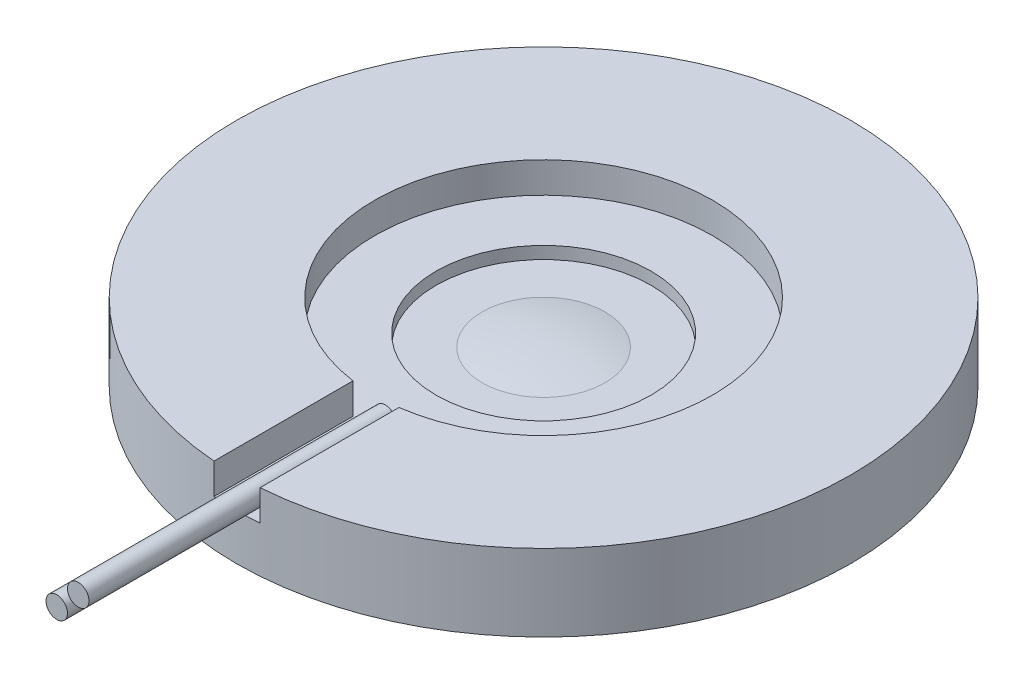
ISO-10303-21;
HEADER;
FILE_DESCRIPTION(('STEP AP214'),'2;1');
FILE_NAME('part.step','',(''),(''),'','','');
FILE_SCHEMA(('AUTOMOTIVE_DESIGN { 1 0 10303 214 1 1 1 1 }'));
ENDSEC;
DATA;
#1=APPLICATION_CONTEXT('core data for automotive mechanical design processes');
#2=APPLICATION_PROTOCOL_DEFINITION('international standard','automotive_design',2000,#1);
#3=PRODUCT_CONTEXT('',#1,'mechanical');
#4=PRODUCT('Part','Part','',(#3));
#5=PRODUCT_RELATED_PRODUCT_CATEGORY('part','',(#4));
#6=PRODUCT_DEFINITION_FORMATION('','',#4);
#7=PRODUCT_DEFINITION_CONTEXT('part definition',#1,'design');
#8=PRODUCT_DEFINITION('design','',#6,#7);
#9=PRODUCT_DEFINITION_SHAPE('','',#8);
#10=(LENGTH_UNIT() NAMED_UNIT(*) SI_UNIT(.MILLI.,.METRE.));
#11=(NAMED_UNIT(*) PLANE_ANGLE_UNIT() SI_UNIT($,.RADIAN.));
#12=(NAMED_UNIT(*) SI_UNIT($,.STERADIAN.) SOLID_ANGLE_UNIT());
#13=UNCERTAINTY_MEASURE_WITH_UNIT(LENGTH_MEASURE(1.E-05),#10,'distance_accuracy_value','');
#14=(GEOMETRIC_REPRESENTATION_CONTEXT(3) GLOBAL_UNCERTAINTY_ASSIGNED_CONTEXT((#13)) GLOBAL_UNIT_ASSIGNED_CONTEXT((#10,
#11,#12)) REPRESENTATION_CONTEXT('',''));
#15=CARTESIAN_POINT('',(0.,0.,0.));
#16=DIRECTION('',(0.,0.,1.));
#17=DIRECTION('',(1.,0.,0.));
#18=AXIS2_PLACEMENT_3D('',#15,#16,#17);
#19=CARTESIAN_POINT('',(0.35,1.05,15.5));
#20=DIRECTION('',(0.,0.,-1.));
#21=DIRECTION('',(-1.,0.,0.));
#22=AXIS2_PLACEMENT_3D('',#19,#20,#21);
#23=CYLINDRICAL_SURFACE('',#22,0.35);
#24=CARTESIAN_POINT('',(0.35,1.05,15.5));
#25=DIRECTION('',(0.,0.,1.));
#26=DIRECTION('',(1.,0.,0.));
#27=AXIS2_PLACEMENT_3D('',#24,#25,#26);
#28=CIRCLE('',#27,0.35);
#29=CARTESIAN_POINT('',(0.7,1.05,15.5));
#30=VERTEX_POINT('',#29);
#31=EDGE_CURVE('E11',#30,#30,#28,.T.);
#32=ORIENTED_EDGE('',*,*,#31,.F.);
#33=EDGE_LOOP('',(#32));
#34=FACE_BOUND('',#33,.T.);
#35=CARTESIAN_POINT('',(0.35,1.05,5.5));
#36=DIRECTION('',(0.,0.,1.));
#37=DIRECTION('',(1.,0.,0.));
#38=AXIS2_PLACEMENT_3D('',#35,#36,#37);
#39=CIRCLE('',#38,0.35);
#40=CARTESIAN_POINT('',(0.7,1.05,5.5));
#41=VERTEX_POINT('',#40);
#42=EDGE_CURVE('E45',#41,#41,#39,.T.);
#43=ORIENTED_EDGE('',*,*,#42,.T.);
#44=EDGE_LOOP('',(#43));
#45=FACE_BOUND('',#44,.T.);
#46=ADVANCED_FACE('F42',(#34,#45),#23,.T.);
#47=CARTESIAN_POINT('',(0.35,1.05,15.5));
#48=DIRECTION('',(0.,0.,1.));
#49=DIRECTION('',(1.,0.,0.));
#50=AXIS2_PLACEMENT_3D('',#47,#48,#49);
#51=PLANE('',#50);
#52=ORIENTED_EDGE('',*,*,#31,.T.);
#53=EDGE_LOOP('',(#52));
#54=FACE_BOUND('',#53,.T.);
#55=ADVANCED_FACE('F57',(#54),#51,.T.);
#56=CARTESIAN_POINT('',(0.35,1.05,5.5));
#57=DIRECTION('',(0.,0.,1.));
#58=DIRECTION('',(1.,0.,0.));
#59=AXIS2_PLACEMENT_3D('',#56,#57,#58);
#60=PLANE('',#59);
#61=ORIENTED_EDGE('',*,*,#42,.F.);
#62=EDGE_LOOP('',(#61));
#63=FACE_BOUND('',#62,.T.);
#64=ADVANCED_FACE('F55',(#63),#60,.F.);
#65=CLOSED_SHELL('',(#46,#55,#64));
#66=MANIFOLD_SOLID_BREP('B2',#65);
#67=CARTESIAN_POINT('',(0.,-1.21621002522873,0.));
#68=DIRECTION('',(0.,-1.,0.));
#69=DIRECTION('',(0.,0.,-1.));
#70=AXIS2_PLACEMENT_3D('',#67,#68,#69);
#71=CYLINDRICAL_SURFACE('',#70,10.);
#72=CARTESIAN_POINT('',(0.,-1.,0.));
#73=DIRECTION('',(0.,-1.,0.));
#74=DIRECTION('',(0.,0.,-1.));
#75=AXIS2_PLACEMENT_3D('',#72,#73,#74);
#76=CIRCLE('',#75,10.);
#77=CARTESIAN_POINT('',(0.,-1.,-10.));
#78=VERTEX_POINT('',#77);
#79=EDGE_CURVE('E210',#78,#78,#76,.T.);
#80=ORIENTED_EDGE('',*,*,#79,.F.);
#81=EDGE_LOOP('',(#80));
#82=FACE_BOUND('',#81,.T.);
#83=CARTESIAN_POINT('',(-0.7,0.35,9.97546991374341));
#84=CARTESIAN_POINT('',(-0.699999126577995,0.330371185065,9.97547002720199));
#85=CARTESIAN_POINT('',(-0.698343158393343,0.310728273173269,9.97558660631598));
#86=CARTESIAN_POINT('',(-0.691760965476584,0.271984473634161,9.97604516974576));
#87=CARTESIAN_POINT('',(-0.68683084283142,0.252884260371821,9.97638742272504));
#88=CARTESIAN_POINT('',(-0.673843019205228,0.215793349188861,9.97727305953802));
#89=CARTESIAN_POINT('',(-0.665787013587679,0.197802055950145,9.97781633433751));
#90=CARTESIAN_POINT('',(-0.646779797303418,0.163432682869438,9.97906639737199));
#91=CARTESIAN_POINT('',(-0.635829272108382,0.147054222339894,9.97977314688842));
#92=CARTESIAN_POINT('',(-0.611325230030255,0.116343038825657,9.98130411980233));
#93=CARTESIAN_POINT('',(-0.597767912589196,0.102013356694386,9.98212851426149));
#94=CARTESIAN_POINT('',(-0.568444171118474,0.0758312133738326,9.98384126875019));
#95=CARTESIAN_POINT('',(-0.552677638996305,0.0639788734667529,9.98472963190856));
#96=CARTESIAN_POINT('',(-0.519349671279672,0.0430660846216249,9.98651863767634));
#97=CARTESIAN_POINT('',(-0.50178493127607,0.0340109029880342,9.98741930015766));
#98=CARTESIAN_POINT('',(-0.465382238795801,0.0189792800572292,9.98918170364694));
#99=CARTESIAN_POINT('',(-0.44654428539803,0.0130028409873526,9.99004344462675));
#100=CARTESIAN_POINT('',(-0.408122933895856,0.00429806621516208,9.99168680938713));
#101=CARTESIAN_POINT('',(-0.388539317194798,0.00157069068400113,9.99246840942194));
#102=CARTESIAN_POINT('',(-0.349188231312043,-0.00055325991143094,9.99392091091746));
#103=CARTESIAN_POINT('',(-0.32942076353444,5.01396075724951E-05,9.99459181322286));
#104=CARTESIAN_POINT('',(-0.290285281214526,0.00457019346665059,9.99580499170035));
#105=CARTESIAN_POINT('',(-0.270916870339192,0.00848338025240826,9.99634740172852));
#106=CARTESIAN_POINT('',(-0.233109662441507,0.0195088815881999,9.99730052090676));
#107=CARTESIAN_POINT('',(-0.214670861227781,0.0266211817128034,9.99771123065068));
#108=CARTESIAN_POINT('',(-0.179266057630678,0.0438350225603465,9.99840873557071));
#109=CARTESIAN_POINT('',(-0.162298608645276,0.0539335831561949,9.99869565358566));
#110=CARTESIAN_POINT('',(-0.130298589102108,0.0768362729505625,9.99916390387877));
#111=CARTESIAN_POINT('',(-0.115266015535367,0.0896403979415073,9.99934523632112));
#112=CARTESIAN_POINT('',(-0.0875659908009353,0.117587863733298,9.99962621665661));
#113=CARTESIAN_POINT('',(-0.074898051804421,0.132730720868452,9.99972588141237));
#114=CARTESIAN_POINT('',(-0.0522831418271938,0.164927863079583,9.99986973810907));
#115=CARTESIAN_POINT('',(-0.0423361739133705,0.181982150309962,9.99991392998749));
#116=CARTESIAN_POINT('',(-0.0254437349668777,0.217521998800979,9.99997121678546));
#117=CARTESIAN_POINT('',(-0.0184988950833139,0.236007860064744,9.99998430516859));
#118=CARTESIAN_POINT('',(-0.00781086524070632,0.273883063441466,9.99999838975036));
#119=CARTESIAN_POINT('',(-0.00406767692141496,0.293272406017143,9.9999993859428));
#120=CARTESIAN_POINT('',(0.000111067984359034,0.332406683310703,10.0000002226889));
#121=CARTESIAN_POINT('',(0.000546224465177146,0.352151660753053,10.0000000631029));
#122=CARTESIAN_POINT('',(-0.00190450471823933,0.391434431398475,9.99999989078871));
#123=CARTESIAN_POINT('',(-0.0047903917578348,0.410972224515741,9.9999998780607));
#124=CARTESIAN_POINT('',(-0.0138013360636407,0.449286212412607,9.99999148062873));
#125=CARTESIAN_POINT('',(-0.0199264270451348,0.46806239926283,9.99998309583763));
#126=CARTESIAN_POINT('',(-0.0352419197869961,0.504319940606687,9.99994081536782));
#127=CARTESIAN_POINT('',(-0.0444323216859587,0.521801295041777,9.99990691968796));
#128=CARTESIAN_POINT('',(-0.0656171864656242,0.55497239985758,9.99979030566469));
#129=CARTESIAN_POINT('',(-0.0776115742031563,0.570662198232895,9.99970758862953));
#130=CARTESIAN_POINT('',(-0.10406378839302,0.599805197300735,9.99946724592183));
#131=CARTESIAN_POINT('',(-0.11852161193156,0.613258400638702,9.99930962033789));
#132=CARTESIAN_POINT('',(-0.149486970050226,0.637544118210207,9.99889458404381));
#133=CARTESIAN_POINT('',(-0.165994149392374,0.648377085681652,9.99863719061119));
#134=CARTESIAN_POINT('',(-0.200590679551237,0.667118100091112,9.99800291624993));
#135=CARTESIAN_POINT('',(-0.218680024985086,0.675026156979818,9.99762603572781));
#136=CARTESIAN_POINT('',(-0.255923438691734,0.687692789046867,9.99674196009453));
#137=CARTESIAN_POINT('',(-0.275077338663992,0.692451860536824,9.99623478553651));
#138=CARTESIAN_POINT('',(-0.313908289945575,0.698689086987504,9.99509073152979));
#139=CARTESIAN_POINT('',(-0.333585343130569,0.700167230183454,9.99445385161599));
#140=CARTESIAN_POINT('',(-0.372913139408768,0.699802604738925,9.99306375048387));
#141=CARTESIAN_POINT('',(-0.39256386709513,0.697958373018055,9.99231047814316));
#142=CARTESIAN_POINT('',(-0.431273993270205,0.691000395225955,9.99071459765174));
#143=CARTESIAN_POINT('',(-0.450333386104116,0.685886617898899,9.98987198864709));
#144=CARTESIAN_POINT('',(-0.487343930658975,0.672527760454949,9.98813495025384));
#145=CARTESIAN_POINT('',(-0.505293764751221,0.664279037524943,9.98724046160957));
#146=CARTESIAN_POINT('',(-0.539552778667938,0.644885030269947,9.98544828329611));
#147=CARTESIAN_POINT('',(-0.555862010591896,0.633739837966468,9.98455059372951));
#148=CARTESIAN_POINT('',(-0.586389423347292,0.60885915703804,9.98280430526458));
#149=CARTESIAN_POINT('',(-0.60060617836213,0.595121916600275,9.98195574007634));
#150=CARTESIAN_POINT('',(-0.626534518415717,0.565445869713904,9.98036190368925));
#151=CARTESIAN_POINT('',(-0.638245494899742,0.549506530005546,9.97961665759795));
#152=CARTESIAN_POINT('',(-0.658819113535951,0.515888945170164,9.97827960932602));
#153=CARTESIAN_POINT('',(-0.667682783466783,0.498211330516201,9.97768775179238));
#154=CARTESIAN_POINT('',(-0.682304879582627,0.461627156791338,9.97669856579779));
#155=CARTESIAN_POINT('',(-0.688067046955156,0.442722109313555,9.97630100302232));
#156=CARTESIAN_POINT('',(-0.694791276832854,0.411413927255972,9.97583436744768));
#157=CARTESIAN_POINT('',(-0.696742057570016,0.399215269914491,9.97569808270832));
#158=CARTESIAN_POINT('',(-0.699346692716377,0.374679599492876,9.97551582025732));
#159=CARTESIAN_POINT('',(-0.700000549207215,0.362342586634844,9.97546984240073));
#160=CARTESIAN_POINT('',(-0.7,0.35,9.97546991374341));
#161=B_SPLINE_CURVE_WITH_KNOTS('',3,(#83,#84,#85,#86,#87,#88,#89,#90,#91,#92,#93,#94,#95,#96,
#97,#98,#99,#100,#101,#102,#103,#104,#105,#106,#107,#108,#109,#110,#111,#112,#113,#114,#115,
#116,#117,#118,#119,#120,#121,#122,#123,#124,#125,#126,#127,#128,#129,#130,#131,#132,#133,#134,
#135,#136,#137,#138,#139,#140,#141,#142,#143,#144,#145,#146,#147,#148,#149,#150,#151,#152,#153,
#154,#155,#156,#157,#158,#159,#160),.UNSPECIFIED.,.T.,.F.,(4,2,2,2,2,2,2,2,2,2,2,2,2,2,2,2,2,2,
2,2,2,2,2,2,2,2,2,2,2,2,2,2,2,2,2,2,2,2,4),(0.,0.05884133984549,0.117752856761926,
0.176632466807841,0.235498145629502,0.294450307154655,0.353405354100388,0.412470751370796,
0.471536191372415,0.5306190822097,0.589701522193501,0.648722140027291,0.707742491728189,
0.766704141930791,0.825665700439513,0.884615081584976,0.943564529173814,1.00252636391523,
1.06148822885442,1.12045722510371,1.17942624577415,1.23839588023626,1.29736551736462,
1.35633357436459,1.41530156161667,1.47425934151622,1.5332169208366,1.59216520563767,
1.65111370181553,1.71008816359775,1.76906318916571,1.8281069544028,1.88714884403487,
1.94623078046516,2.00532704932102,2.06440196244612,2.12340545584628,2.16040491316662,
2.19740431110064),.UNSPECIFIED.);
#162=CARTESIAN_POINT('',(-0.666227766016838,0.499999999999999,9.97778234698414));
#163=VERTEX_POINT('',#162);
#164=CARTESIAN_POINT('',(-0.0337722339831618,0.499999999999999,9.99994297164798));
#165=VERTEX_POINT('',#164);
#166=EDGE_CURVE('E105',#163,#165,#161,.T.);
#167=ORIENTED_EDGE('',*,*,#166,.F.);
#168=CARTESIAN_POINT('',(0.,0.499999999999999,0.));
#169=DIRECTION('',(0.,-1.,0.));
#170=DIRECTION('',(0.,0.,-1.));
#171=AXIS2_PLACEMENT_3D('',#168,#169,#170);
#172=CIRCLE('',#171,10.);
#173=CARTESIAN_POINT('',(-0.75794299769201,0.5,9.97123474862816));
#174=VERTEX_POINT('',#173);
#175=EDGE_CURVE('E135',#163,#174,#172,.T.);
#176=ORIENTED_EDGE('',*,*,#175,.T.);
#177=DIRECTION('',(0.,-1.,0.));
#178=VECTOR('',#177,1.);
#179=CARTESIAN_POINT('',(-0.75794299769201,-1.21621002522873,9.97123474862816));
#180=LINE('',#179,#178);
#181=CARTESIAN_POINT('',(-0.75794299769201,1.5,9.97123474862816));
#182=VERTEX_POINT('',#181);
#183=EDGE_CURVE('E355',#174,#182,#180,.F.);
#184=ORIENTED_EDGE('',*,*,#183,.T.);
#185=CARTESIAN_POINT('',(0.,1.5,0.));
#186=DIRECTION('',(0.,-1.,0.));
#187=DIRECTION('',(0.,0.,-1.));
#188=AXIS2_PLACEMENT_3D('',#185,#186,#187);
#189=CIRCLE('',#188,10.);
#190=CARTESIAN_POINT('',(0.74205700230799,1.5,9.97242956381872));
#191=VERTEX_POINT('',#190);
#192=EDGE_CURVE('E213',#182,#191,#189,.T.);
#193=ORIENTED_EDGE('',*,*,#192,.T.);
#194=DIRECTION('',(0.,-1.,0.));
#195=VECTOR('',#194,1.);
#196=CARTESIAN_POINT('',(0.74205700230799,-1.21621002522873,9.97242956381872));
#197=LINE('',#196,#195);
#198=CARTESIAN_POINT('',(0.74205700230799,0.5,9.97242956381872));
#199=VERTEX_POINT('',#198);
#200=EDGE_CURVE('E361',#191,#199,#197,.T.);
#201=ORIENTED_EDGE('',*,*,#200,.T.);
#202=EDGE_CURVE('E353',#199,#165,#172,.T.);
#203=ORIENTED_EDGE('',*,*,#202,.T.);
#204=EDGE_LOOP('',(#167,#176,#184,#193,#201,#203));
#205=FACE_BOUND('',#204,.T.);
#206=ADVANCED_FACE('F82',(#82,#205),#71,.T.);
#207=CARTESIAN_POINT('',(-5.5,0.499999999999999,0.));
#208=DIRECTION('',(0.,-1.,0.));
#209=DIRECTION('',(0.,0.,-1.));
#210=AXIS2_PLACEMENT_3D('',#207,#208,#209);
#211=PLANE('',#210);
#212=CARTESIAN_POINT('',(0.,0.499999999999999,0.));
#213=DIRECTION('',(0.,-1.,0.));
#214=DIRECTION('',(0.,0.,-1.));
#215=AXIS2_PLACEMENT_3D('',#212,#213,#214);
#216=CIRCLE('',#215,3.5);
#217=CARTESIAN_POINT('',(0.,0.499999999999999,-3.5));
#218=VERTEX_POINT('',#217);
#219=EDGE_CURVE('E344',#218,#218,#216,.T.);
#220=ORIENTED_EDGE('',*,*,#219,.T.);
#221=EDGE_LOOP('',(#220));
#222=FACE_BOUND('',#221,.T.);
#223=DIRECTION('',(0.,0.,-1.));
#224=VECTOR('',#223,1.);
#225=CARTESIAN_POINT('',(-0.666227766016838,0.499999999999999,15.5));
#226=LINE('',#225,#224);
#227=CARTESIAN_POINT('',(-0.666227766016838,0.499999999999999,5.5));
#228=VERTEX_POINT('',#227);
#229=EDGE_CURVE('E40',#228,#163,#226,.F.);
#230=ORIENTED_EDGE('',*,*,#229,.F.);
#231=DIRECTION('',(-1.,0.,0.));
#232=VECTOR('',#231,1.);
#233=CARTESIAN_POINT('',(-5.5,0.499999999999999,5.5));
#234=LINE('',#233,#232);
#235=CARTESIAN_POINT('',(-0.0337722339831618,0.499999999999999,5.5));
#236=VERTEX_POINT('',#235);
#237=EDGE_CURVE('E97',#236,#228,#234,.T.);
#238=ORIENTED_EDGE('',*,*,#237,.F.);
#239=DIRECTION('',(0.,0.,-1.));
#240=VECTOR('',#239,1.);
#241=CARTESIAN_POINT('',(-0.0337722339831618,0.499999999999999,15.5));
#242=LINE('',#241,#240);
#243=EDGE_CURVE('E90',#165,#236,#242,.T.);
#244=ORIENTED_EDGE('',*,*,#243,.F.);
#245=ORIENTED_EDGE('',*,*,#202,.F.);
#246=DIRECTION('',(0.,0.,-1.));
#247=VECTOR('',#246,1.);
#248=CARTESIAN_POINT('',(0.74205700230799,0.5,10.5892241721086));
#249=LINE('',#248,#247);
#250=CARTESIAN_POINT('',(0.74205700230799,0.5,5.44971113044771));
#251=VERTEX_POINT('',#250);
#252=EDGE_CURVE('E367',#199,#251,#249,.T.);
#253=ORIENTED_EDGE('',*,*,#252,.T.);
#254=CARTESIAN_POINT('',(0.,0.499999999999999,0.));
#255=DIRECTION('',(0.,-1.,0.));
#256=DIRECTION('',(0.,0.,-1.));
#257=AXIS2_PLACEMENT_3D('',#254,#255,#256);
#258=CIRCLE('',#257,5.5);
#259=CARTESIAN_POINT('',(-0.75794299769201,0.5,5.44752442970655));
#260=VERTEX_POINT('',#259);
#261=EDGE_CURVE('E341',#260,#251,#258,.T.);
#262=ORIENTED_EDGE('',*,*,#261,.F.);
#263=DIRECTION('',(0.,0.,1.));
#264=VECTOR('',#263,1.);
#265=CARTESIAN_POINT('',(-0.75794299769201,0.5,10.5892241721086));
#266=LINE('',#265,#264);
#267=EDGE_CURVE('E368',#260,#174,#266,.T.);
#268=ORIENTED_EDGE('',*,*,#267,.T.);
#269=ORIENTED_EDGE('',*,*,#175,.F.);
#270=EDGE_LOOP('',(#230,#238,#244,#245,#253,#262,#268,#269));
#271=FACE_BOUND('',#270,.T.);
#272=ADVANCED_FACE('F133',(#222,#271),#211,.F.);
#273=CARTESIAN_POINT('',(0.,-9.8,0.));
#274=DIRECTION('',(0.,-1.,0.));
#275=DIRECTION('',(-1.,0.,0.));
#276=AXIS2_PLACEMENT_3D('',#273,#274,#275);
#277=SPHERICAL_SURFACE('',#276,10.);
#278=CARTESIAN_POINT('',(0.,0.,0.));
#279=DIRECTION('',(0.,-1.,0.));
#280=DIRECTION('',(0.,0.,-1.));
#281=AXIS2_PLACEMENT_3D('',#278,#279,#280);
#282=CIRCLE('',#281,1.98997487421324);
#283=CARTESIAN_POINT('',(0.,0.,-1.98997487421324));
#284=VERTEX_POINT('',#283);
#285=EDGE_CURVE('E142',#284,#284,#282,.T.);
#286=ORIENTED_EDGE('',*,*,#285,.T.);
#287=EDGE_LOOP('',(#286));
#288=FACE_BOUND('',#287,.T.);
#289=ADVANCED_FACE('F84',(#288),#277,.F.);
#290=CARTESIAN_POINT('',(-1.98997487421324,0.,0.));
#291=DIRECTION('',(0.,1.,0.));
#292=DIRECTION('',(0.,0.,1.));
#293=AXIS2_PLACEMENT_3D('',#290,#291,#292);
#294=PLANE('',#293);
#295=CARTESIAN_POINT('',(0.,0.,0.));
#296=DIRECTION('',(0.,-1.,0.));
#297=DIRECTION('',(0.,0.,-1.));
#298=AXIS2_PLACEMENT_3D('',#295,#296,#297);
#299=CIRCLE('',#298,6.);
#300=CARTESIAN_POINT('',(0.,0.,-6.));
#301=VERTEX_POINT('',#300);
#302=EDGE_CURVE('E216',#301,#301,#299,.T.);
#303=ORIENTED_EDGE('',*,*,#302,.T.);
#304=EDGE_LOOP('',(#303));
#305=FACE_BOUND('',#304,.T.);
#306=ORIENTED_EDGE('',*,*,#285,.F.);
#307=EDGE_LOOP('',(#306));
#308=FACE_BOUND('',#307,.T.);
#309=ADVANCED_FACE('F229',(#305,#308),#294,.F.);
#310=CARTESIAN_POINT('',(0.,-1.21621002522873,0.));
#311=DIRECTION('',(0.,-1.,0.));
#312=DIRECTION('',(0.,0.,-1.));
#313=AXIS2_PLACEMENT_3D('',#310,#311,#312);
#314=CYLINDRICAL_SURFACE('',#313,6.);
#315=ORIENTED_EDGE('',*,*,#302,.F.);
#316=EDGE_LOOP('',(#315));
#317=FACE_BOUND('',#316,.T.);
#318=CARTESIAN_POINT('',(0.,-1.,0.));
#319=DIRECTION('',(0.,-1.,0.));
#320=DIRECTION('',(0.,0.,-1.));
#321=AXIS2_PLACEMENT_3D('',#318,#319,#320);
#322=CIRCLE('',#321,6.);
#323=CARTESIAN_POINT('',(0.,-1.,-6.));
#324=VERTEX_POINT('',#323);
#325=EDGE_CURVE('E212',#324,#324,#322,.T.);
#326=ORIENTED_EDGE('',*,*,#325,.T.);
#327=EDGE_LOOP('',(#326));
#328=FACE_BOUND('',#327,.T.);
#329=ADVANCED_FACE('F201',(#317,#328),#314,.F.);
#330=CARTESIAN_POINT('',(-6.,-1.,0.));
#331=DIRECTION('',(0.,1.,0.));
#332=DIRECTION('',(0.,0.,1.));
#333=AXIS2_PLACEMENT_3D('',#330,#331,#332);
#334=PLANE('',#333);
#335=ORIENTED_EDGE('',*,*,#325,.F.);
#336=EDGE_LOOP('',(#335));
#337=FACE_BOUND('',#336,.T.);
#338=ORIENTED_EDGE('',*,*,#79,.T.);
#339=EDGE_LOOP('',(#338));
#340=FACE_BOUND('',#339,.T.);
#341=ADVANCED_FACE('F196',(#337,#340),#334,.F.);
#342=CARTESIAN_POINT('',(-10.,1.5,0.));
#343=DIRECTION('',(0.,-1.,0.));
#344=DIRECTION('',(0.,0.,-1.));
#345=AXIS2_PLACEMENT_3D('',#342,#343,#344);
#346=PLANE('',#345);
#347=ORIENTED_EDGE('',*,*,#192,.F.);
#348=DIRECTION('',(0.,0.,1.));
#349=VECTOR('',#348,1.);
#350=CARTESIAN_POINT('',(-0.75794299769201,1.5,10.5892241721086));
#351=LINE('',#350,#349);
#352=CARTESIAN_POINT('',(-0.75794299769201,1.5,5.44752442970655));
#353=VERTEX_POINT('',#352);
#354=EDGE_CURVE('E157',#353,#182,#351,.T.);
#355=ORIENTED_EDGE('',*,*,#354,.F.);
#356=CARTESIAN_POINT('',(0.,1.5,0.));
#357=DIRECTION('',(0.,-1.,0.));
#358=DIRECTION('',(0.,0.,-1.));
#359=AXIS2_PLACEMENT_3D('',#356,#357,#358);
#360=CIRCLE('',#359,5.5);
#361=CARTESIAN_POINT('',(0.74205700230799,1.5,5.44971113044771));
#362=VERTEX_POINT('',#361);
#363=EDGE_CURVE('E219',#353,#362,#360,.T.);
#364=ORIENTED_EDGE('',*,*,#363,.T.);
#365=DIRECTION('',(0.,0.,-1.));
#366=VECTOR('',#365,1.);
#367=CARTESIAN_POINT('',(0.74205700230799,1.5,10.5892241721086));
#368=LINE('',#367,#366);
#369=EDGE_CURVE('E156',#191,#362,#368,.T.);
#370=ORIENTED_EDGE('',*,*,#369,.F.);
#371=EDGE_LOOP('',(#347,#355,#364,#370));
#372=FACE_BOUND('',#371,.T.);
#373=ADVANCED_FACE('F193',(#372),#346,.F.);
#374=CARTESIAN_POINT('',(0.,-1.21621002522873,0.));
#375=DIRECTION('',(0.,-1.,0.));
#376=DIRECTION('',(0.,0.,-1.));
#377=AXIS2_PLACEMENT_3D('',#374,#375,#376);
#378=CYLINDRICAL_SURFACE('',#377,5.5);
#379=ORIENTED_EDGE('',*,*,#363,.F.);
#380=DIRECTION('',(0.,-1.,0.));
#381=VECTOR('',#380,1.);
#382=CARTESIAN_POINT('',(-0.75794299769201,-1.21621002522873,5.44752442970655));
#383=LINE('',#382,#381);
#384=EDGE_CURVE('E358',#353,#260,#383,.T.);
#385=ORIENTED_EDGE('',*,*,#384,.T.);
#386=ORIENTED_EDGE('',*,*,#261,.T.);
#387=DIRECTION('',(0.,-1.,0.));
#388=VECTOR('',#387,1.);
#389=CARTESIAN_POINT('',(0.74205700230799,-1.21621002522873,5.44971113044771));
#390=LINE('',#389,#388);
#391=EDGE_CURVE('E364',#251,#362,#390,.F.);
#392=ORIENTED_EDGE('',*,*,#391,.T.);
#393=EDGE_LOOP('',(#379,#385,#386,#392));
#394=FACE_BOUND('',#393,.T.);
#395=ADVANCED_FACE('F187',(#394),#378,.F.);
#396=CARTESIAN_POINT('',(0.,-1.21621002522873,0.));
#397=DIRECTION('',(0.,-1.,0.));
#398=DIRECTION('',(0.,0.,-1.));
#399=AXIS2_PLACEMENT_3D('',#396,#397,#398);
#400=CYLINDRICAL_SURFACE('',#399,3.5);
#401=ORIENTED_EDGE('',*,*,#219,.F.);
#402=EDGE_LOOP('',(#401));
#403=FACE_BOUND('',#402,.T.);
#404=CARTESIAN_POINT('',(0.,0.0999999999999998,0.));
#405=DIRECTION('',(0.,-1.,0.));
#406=DIRECTION('',(0.,0.,-1.));
#407=AXIS2_PLACEMENT_3D('',#404,#405,#406);
#408=CIRCLE('',#407,3.5);
#409=CARTESIAN_POINT('',(0.,0.0999999999999998,-3.5));
#410=VERTEX_POINT('',#409);
#411=EDGE_CURVE('E347',#410,#410,#408,.T.);
#412=ORIENTED_EDGE('',*,*,#411,.T.);
#413=EDGE_LOOP('',(#412));
#414=FACE_BOUND('',#413,.T.);
#415=ADVANCED_FACE('F183',(#403,#414),#400,.F.);
#416=CARTESIAN_POINT('',(-3.5,0.0999999999999997,0.));
#417=DIRECTION('',(0.,-1.,0.));
#418=DIRECTION('',(0.,0.,-1.));
#419=AXIS2_PLACEMENT_3D('',#416,#417,#418);
#420=PLANE('',#419);
#421=ORIENTED_EDGE('',*,*,#411,.F.);
#422=EDGE_LOOP('',(#421));
#423=FACE_BOUND('',#422,.T.);
#424=CARTESIAN_POINT('',(0.,0.0999999999999996,0.));
#425=DIRECTION('',(0.,-1.,0.));
#426=DIRECTION('',(0.,0.,-1.));
#427=AXIS2_PLACEMENT_3D('',#424,#425,#426);
#428=CIRCLE('',#427,2.);
#429=CARTESIAN_POINT('',(0.,0.0999999999999996,-2.));
#430=VERTEX_POINT('',#429);
#431=EDGE_CURVE('E350',#430,#430,#428,.T.);
#432=ORIENTED_EDGE('',*,*,#431,.T.);
#433=EDGE_LOOP('',(#432));
#434=FACE_BOUND('',#433,.T.);
#435=ADVANCED_FACE('F179',(#423,#434),#420,.F.);
#436=CARTESIAN_POINT('',(0.,-9.8,0.));
#437=DIRECTION('',(0.,-1.,0.));
#438=DIRECTION('',(-1.,0.,0.));
#439=AXIS2_PLACEMENT_3D('',#436,#437,#438);
#440=SPHERICAL_SURFACE('',#439,10.1);
#441=ORIENTED_EDGE('',*,*,#431,.F.);
#442=EDGE_LOOP('',(#441));
#443=FACE_BOUND('',#442,.T.);
#444=ADVANCED_FACE('F175',(#443),#440,.T.);
#445=CARTESIAN_POINT('',(-0.75794299769201,-6.03634580075554,10.5892241721086));
#446=DIRECTION('',(-1.,0.,0.));
#447=DIRECTION('',(0.,0.,1.));
#448=AXIS2_PLACEMENT_3D('',#445,#446,#447);
#449=PLANE('',#448);
#450=ORIENTED_EDGE('',*,*,#267,.F.);
#451=ORIENTED_EDGE('',*,*,#384,.F.);
#452=ORIENTED_EDGE('',*,*,#354,.T.);
#453=ORIENTED_EDGE('',*,*,#183,.F.);
#454=EDGE_LOOP('',(#450,#451,#452,#453));
#455=FACE_BOUND('',#454,.T.);
#456=ADVANCED_FACE('F171',(#455),#449,.F.);
#457=CARTESIAN_POINT('',(0.74205700230799,-6.03634580075554,10.5892241721086));
#458=DIRECTION('',(1.,0.,0.));
#459=DIRECTION('',(0.,0.,-1.));
#460=AXIS2_PLACEMENT_3D('',#457,#458,#459);
#461=PLANE('',#460);
#462=ORIENTED_EDGE('',*,*,#369,.T.);
#463=ORIENTED_EDGE('',*,*,#391,.F.);
#464=ORIENTED_EDGE('',*,*,#252,.F.);
#465=ORIENTED_EDGE('',*,*,#200,.F.);
#466=EDGE_LOOP('',(#462,#463,#464,#465));
#467=FACE_BOUND('',#466,.T.);
#468=ADVANCED_FACE('F166',(#467),#461,.F.);
#469=CARTESIAN_POINT('',(-0.35,0.35,15.5));
#470=DIRECTION('',(0.,0.,-1.));
#471=DIRECTION('',(-1.,0.,0.));
#472=AXIS2_PLACEMENT_3D('',#469,#470,#471);
#473=CYLINDRICAL_SURFACE('',#472,0.35);
#474=CARTESIAN_POINT('',(-0.35,0.35,15.5));
#475=DIRECTION('',(0.,0.,1.));
#476=DIRECTION('',(1.,0.,0.));
#477=AXIS2_PLACEMENT_3D('',#474,#475,#476);
#478=CIRCLE('',#477,0.35);
#479=CARTESIAN_POINT('',(0.,0.35,15.5));
#480=VERTEX_POINT('',#479);
#481=EDGE_CURVE('E145',#480,#480,#478,.T.);
#482=ORIENTED_EDGE('',*,*,#481,.F.);
#483=EDGE_LOOP('',(#482));
#484=FACE_BOUND('',#483,.T.);
#485=CARTESIAN_POINT('',(-0.35,0.35,5.5));
#486=DIRECTION('',(0.,0.,1.));
#487=DIRECTION('',(1.,0.,0.));
#488=AXIS2_PLACEMENT_3D('',#485,#486,#487);
#489=CIRCLE('',#488,0.35);
#490=EDGE_CURVE('E141',#236,#228,#489,.T.);
#491=ORIENTED_EDGE('',*,*,#490,.T.);
#492=ORIENTED_EDGE('',*,*,#229,.T.);
#493=ORIENTED_EDGE('',*,*,#166,.T.);
#494=ORIENTED_EDGE('',*,*,#243,.T.);
#495=EDGE_LOOP('',(#491,#492,#493,#494));
#496=FACE_BOUND('',#495,.T.);
#497=ADVANCED_FACE('F144',(#484,#496),#473,.T.);
#498=CARTESIAN_POINT('',(-0.35,0.35,5.5));
#499=DIRECTION('',(0.,0.,1.));
#500=DIRECTION('',(1.,0.,0.));
#501=AXIS2_PLACEMENT_3D('',#498,#499,#500);
#502=PLANE('',#501);
#503=ORIENTED_EDGE('',*,*,#490,.F.);
#504=ORIENTED_EDGE('',*,*,#237,.T.);
#505=EDGE_LOOP('',(#503,#504));
#506=FACE_BOUND('',#505,.T.);
#507=ADVANCED_FACE('F140',(#506),#502,.F.);
#508=CARTESIAN_POINT('',(-0.35,0.35,15.5));
#509=DIRECTION('',(0.,0.,1.));
#510=DIRECTION('',(1.,0.,0.));
#511=AXIS2_PLACEMENT_3D('',#508,#509,#510);
#512=PLANE('',#511);
#513=ORIENTED_EDGE('',*,*,#481,.T.);
#514=EDGE_LOOP('',(#513));
#515=FACE_BOUND('',#514,.T.);
#516=ADVANCED_FACE('F278',(#515),#512,.T.);
#517=CLOSED_SHELL('',(#206,#272,#289,#309,#329,#341,#373,#395,#415,#435,#444,#456,#468,#497,
#507,#516));
#518=MANIFOLD_SOLID_BREP('B6',#517);
#519=ADVANCED_BREP_SHAPE_REPRESENTATION('',(#18,#66,#518),#14);
#520=SHAPE_DEFINITION_REPRESENTATION(#9,#519);
ENDSEC;
END-ISO-10303-21;
